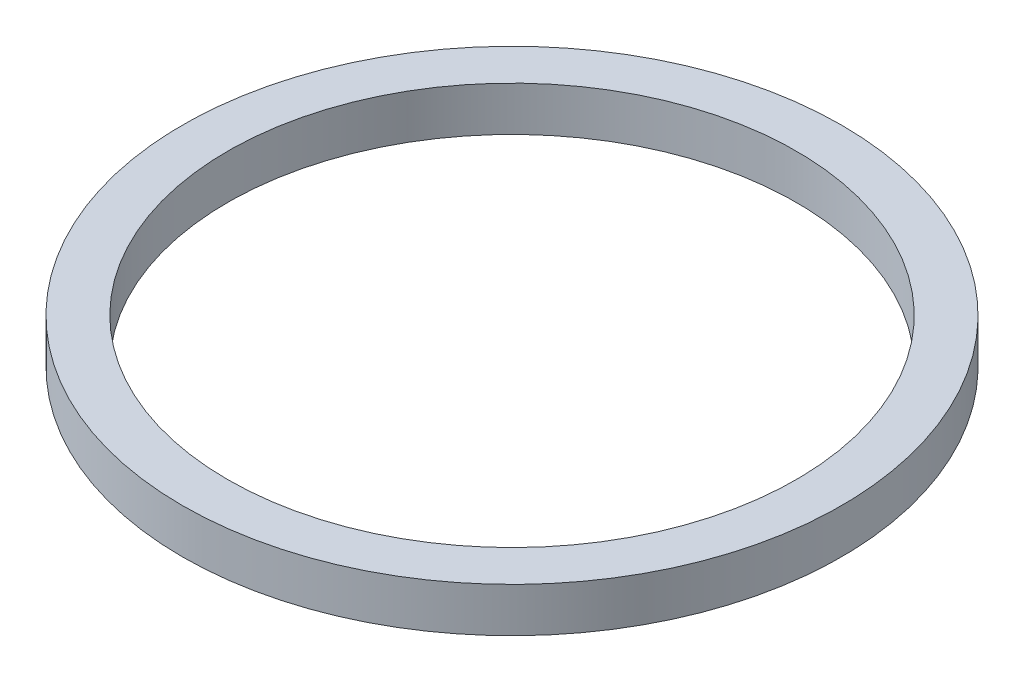
ISO-10303-21;
HEADER;
FILE_DESCRIPTION(('STEP AP214'),'2;1');
FILE_NAME('part.step','',(''),(''),'','','');
FILE_SCHEMA(('AUTOMOTIVE_DESIGN { 1 0 10303 214 1 1 1 1 }'));
ENDSEC;
DATA;
#1=APPLICATION_CONTEXT('core data for automotive mechanical design processes');
#2=APPLICATION_PROTOCOL_DEFINITION('international standard','automotive_design',2000,#1);
#3=PRODUCT_CONTEXT('',#1,'mechanical');
#4=PRODUCT('Part','Part','',(#3));
#5=PRODUCT_RELATED_PRODUCT_CATEGORY('part','',(#4));
#6=PRODUCT_DEFINITION_FORMATION('','',#4);
#7=PRODUCT_DEFINITION_CONTEXT('part definition',#1,'design');
#8=PRODUCT_DEFINITION('design','',#6,#7);
#9=PRODUCT_DEFINITION_SHAPE('','',#8);
#10=(LENGTH_UNIT() NAMED_UNIT(*) SI_UNIT(.MILLI.,.METRE.));
#11=(NAMED_UNIT(*) PLANE_ANGLE_UNIT() SI_UNIT($,.RADIAN.));
#12=(NAMED_UNIT(*) SI_UNIT($,.STERADIAN.) SOLID_ANGLE_UNIT());
#13=UNCERTAINTY_MEASURE_WITH_UNIT(LENGTH_MEASURE(1.E-05),#10,'distance_accuracy_value','');
#14=(GEOMETRIC_REPRESENTATION_CONTEXT(3) GLOBAL_UNCERTAINTY_ASSIGNED_CONTEXT((#13)) GLOBAL_UNIT_ASSIGNED_CONTEXT((#10,
#11,#12)) REPRESENTATION_CONTEXT('',''));
#15=CARTESIAN_POINT('',(0.,0.,0.));
#16=DIRECTION('',(0.,0.,1.));
#17=DIRECTION('',(1.,0.,0.));
#18=AXIS2_PLACEMENT_3D('',#15,#16,#17);
#19=CARTESIAN_POINT('',(0.,25.,0.));
#20=DIRECTION('',(0.,1.,0.));
#21=DIRECTION('',(0.,0.,1.));
#22=AXIS2_PLACEMENT_3D('',#19,#20,#21);
#23=PLANE('',#22);
#24=CARTESIAN_POINT('',(0.,25.,0.));
#25=DIRECTION('',(0.,1.,0.));
#26=DIRECTION('',(0.,0.,1.));
#27=AXIS2_PLACEMENT_3D('',#24,#25,#26);
#28=CIRCLE('',#27,185.4);
#29=CARTESIAN_POINT('',(0.,25.,185.4));
#30=VERTEX_POINT('',#29);
#31=EDGE_CURVE('E10',#30,#30,#28,.T.);
#32=ORIENTED_EDGE('',*,*,#31,.T.);
#33=EDGE_LOOP('',(#32));
#34=FACE_BOUND('',#33,.T.);
#35=CARTESIAN_POINT('',(0.,25.,0.));
#36=DIRECTION('',(0.,1.,0.));
#37=DIRECTION('',(0.,0.,1.));
#38=AXIS2_PLACEMENT_3D('',#35,#36,#37);
#39=CIRCLE('',#38,160.);
#40=CARTESIAN_POINT('',(0.,25.,160.));
#41=VERTEX_POINT('',#40);
#42=EDGE_CURVE('E50',#41,#41,#39,.T.);
#43=ORIENTED_EDGE('',*,*,#42,.F.);
#44=EDGE_LOOP('',(#43));
#45=FACE_BOUND('',#44,.T.);
#46=ADVANCED_FACE('F39',(#34,#45),#23,.T.);
#47=CARTESIAN_POINT('',(0.,0.,0.));
#48=DIRECTION('',(0.,1.,0.));
#49=DIRECTION('',(0.,0.,1.));
#50=AXIS2_PLACEMENT_3D('',#47,#48,#49);
#51=PLANE('',#50);
#52=CARTESIAN_POINT('',(0.,0.,0.));
#53=DIRECTION('',(0.,1.,0.));
#54=DIRECTION('',(0.,0.,1.));
#55=AXIS2_PLACEMENT_3D('',#52,#53,#54);
#56=CIRCLE('',#55,185.4);
#57=CARTESIAN_POINT('',(0.,0.,185.4));
#58=VERTEX_POINT('',#57);
#59=EDGE_CURVE('E43',#58,#58,#56,.T.);
#60=ORIENTED_EDGE('',*,*,#59,.F.);
#61=EDGE_LOOP('',(#60));
#62=FACE_BOUND('',#61,.T.);
#63=CARTESIAN_POINT('',(0.,0.,0.));
#64=DIRECTION('',(0.,1.,0.));
#65=DIRECTION('',(0.,0.,1.));
#66=AXIS2_PLACEMENT_3D('',#63,#64,#65);
#67=CIRCLE('',#66,160.);
#68=CARTESIAN_POINT('',(0.,0.,160.));
#69=VERTEX_POINT('',#68);
#70=EDGE_CURVE('E52',#69,#69,#67,.T.);
#71=ORIENTED_EDGE('',*,*,#70,.T.);
#72=EDGE_LOOP('',(#71));
#73=FACE_BOUND('',#72,.T.);
#74=ADVANCED_FACE('F62',(#62,#73),#51,.F.);
#75=CARTESIAN_POINT('',(0.,25.,0.));
#76=DIRECTION('',(0.,-1.,0.));
#77=DIRECTION('',(0.,0.,-1.));
#78=AXIS2_PLACEMENT_3D('',#75,#76,#77);
#79=CYLINDRICAL_SURFACE('',#78,185.4);
#80=ORIENTED_EDGE('',*,*,#31,.F.);
#81=EDGE_LOOP('',(#80));
#82=FACE_BOUND('',#81,.T.);
#83=ORIENTED_EDGE('',*,*,#59,.T.);
#84=EDGE_LOOP('',(#83));
#85=FACE_BOUND('',#84,.T.);
#86=ADVANCED_FACE('F41',(#82,#85),#79,.T.);
#87=CARTESIAN_POINT('',(0.,25.,0.));
#88=DIRECTION('',(0.,-1.,0.));
#89=DIRECTION('',(0.,0.,-1.));
#90=AXIS2_PLACEMENT_3D('',#87,#88,#89);
#91=CYLINDRICAL_SURFACE('',#90,160.);
#92=ORIENTED_EDGE('',*,*,#42,.T.);
#93=EDGE_LOOP('',(#92));
#94=FACE_BOUND('',#93,.T.);
#95=ORIENTED_EDGE('',*,*,#70,.F.);
#96=EDGE_LOOP('',(#95));
#97=FACE_BOUND('',#96,.T.);
#98=ADVANCED_FACE('F58',(#94,#97),#91,.F.);
#99=CLOSED_SHELL('',(#46,#74,#86,#98));
#100=MANIFOLD_SOLID_BREP('B2',#99);
#101=ADVANCED_BREP_SHAPE_REPRESENTATION('',(#18,#100),#14);
#102=SHAPE_DEFINITION_REPRESENTATION(#9,#101);
ENDSEC;
END-ISO-10303-21;
